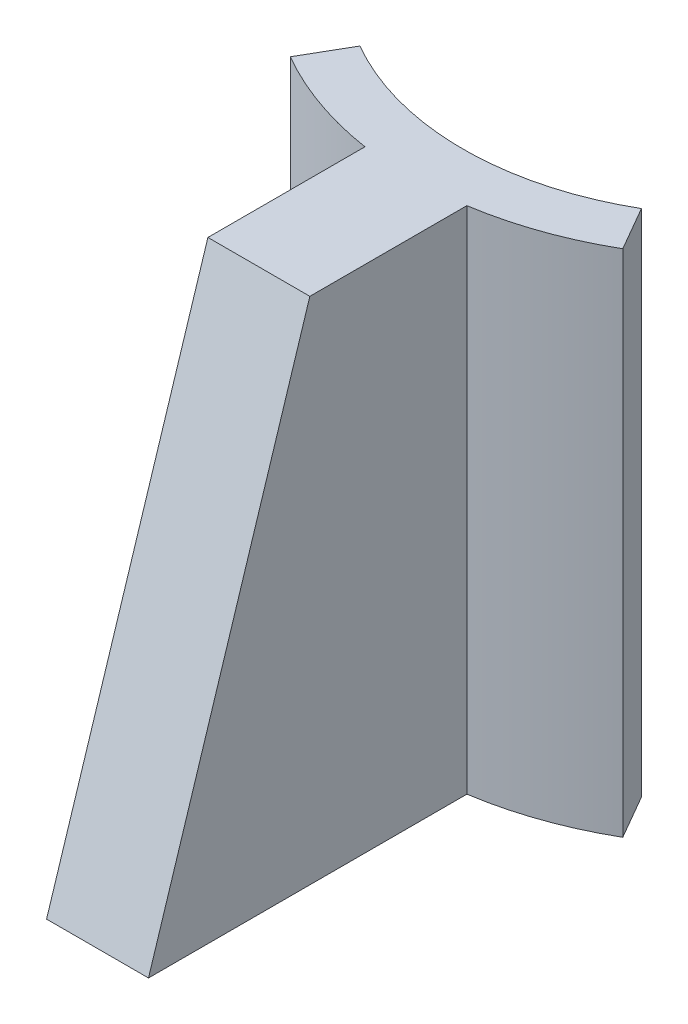
ISO-10303-21;
HEADER;
FILE_DESCRIPTION(('STEP AP214'),'2;1');
FILE_NAME('part.step','',(''),(''),'','','');
FILE_SCHEMA(('AUTOMOTIVE_DESIGN { 1 0 10303 214 1 1 1 1 }'));
ENDSEC;
DATA;
#1=APPLICATION_CONTEXT('core data for automotive mechanical design processes');
#2=APPLICATION_PROTOCOL_DEFINITION('international standard','automotive_design',2000,#1);
#3=PRODUCT_CONTEXT('',#1,'mechanical');
#4=PRODUCT('Part','Part','',(#3));
#5=PRODUCT_RELATED_PRODUCT_CATEGORY('part','',(#4));
#6=PRODUCT_DEFINITION_FORMATION('','',#4);
#7=PRODUCT_DEFINITION_CONTEXT('part definition',#1,'design');
#8=PRODUCT_DEFINITION('design','',#6,#7);
#9=PRODUCT_DEFINITION_SHAPE('','',#8);
#10=(LENGTH_UNIT() NAMED_UNIT(*) SI_UNIT(.MILLI.,.METRE.));
#11=(NAMED_UNIT(*) PLANE_ANGLE_UNIT() SI_UNIT($,.RADIAN.));
#12=(NAMED_UNIT(*) SI_UNIT($,.STERADIAN.) SOLID_ANGLE_UNIT());
#13=UNCERTAINTY_MEASURE_WITH_UNIT(LENGTH_MEASURE(1.E-05),#10,'distance_accuracy_value','');
#14=(GEOMETRIC_REPRESENTATION_CONTEXT(3) GLOBAL_UNCERTAINTY_ASSIGNED_CONTEXT((#13)) GLOBAL_UNIT_ASSIGNED_CONTEXT((#10,
#11,#12)) REPRESENTATION_CONTEXT('',''));
#15=CARTESIAN_POINT('',(0.,0.,0.));
#16=DIRECTION('',(0.,0.,1.));
#17=DIRECTION('',(1.,0.,0.));
#18=AXIS2_PLACEMENT_3D('',#15,#16,#17);
#19=CARTESIAN_POINT('',(-0.5,4.,0.));
#20=DIRECTION('',(0.,1.,0.));
#21=DIRECTION('',(-1.,0.,0.));
#22=AXIS2_PLACEMENT_3D('',#19,#20,#21);
#23=PLANE('',#22);
#24=DIRECTION('',(0.,0.,1.));
#25=VECTOR('',#24,1.);
#26=CARTESIAN_POINT('',(-0.5,4.,0.));
#27=LINE('',#26,#25);
#28=CARTESIAN_POINT('',(-0.5,4.,3.22335229225724));
#29=VERTEX_POINT('',#28);
#30=CARTESIAN_POINT('',(-0.5,4.,6.34647459209148));
#31=VERTEX_POINT('',#30);
#32=EDGE_CURVE('E61',#29,#31,#27,.T.);
#33=ORIENTED_EDGE('',*,*,#32,.F.);
#34=CARTESIAN_POINT('',(0.,4.,0.));
#35=DIRECTION('',(0.,1.,0.));
#36=DIRECTION('',(-1.,0.,0.));
#37=AXIS2_PLACEMENT_3D('',#34,#35,#36);
#38=CIRCLE('',#37,3.26190128606002);
#39=CARTESIAN_POINT('',(-1.6309509276015,4.,2.82488921406768));
#40=VERTEX_POINT('',#39);
#41=EDGE_CURVE('E150',#40,#29,#38,.T.);
#42=ORIENTED_EDGE('',*,*,#41,.F.);
#43=DIRECTION('',(-0.500000041754144,0.,0.866025379677671));
#44=VECTOR('',#43,1.);
#45=CARTESIAN_POINT('',(-1.38095090672443,4.,2.39187652422884));
#46=LINE('',#45,#44);
#47=CARTESIAN_POINT('',(-1.38095090672442,4.,2.39187652422883));
#48=VERTEX_POINT('',#47);
#49=EDGE_CURVE('E134',#48,#40,#46,.T.);
#50=ORIENTED_EDGE('',*,*,#49,.F.);
#51=CARTESIAN_POINT('',(0.,4.,0.));
#52=DIRECTION('',(0.,1.,0.));
#53=DIRECTION('',(-1.,0.,0.));
#54=AXIS2_PLACEMENT_3D('',#51,#52,#53);
#55=CIRCLE('',#54,2.76190128606002);
#56=CARTESIAN_POINT('',(1.38095090672443,4.,2.39187652422884));
#57=VERTEX_POINT('',#56);
#58=EDGE_CURVE('E156',#48,#57,#55,.T.);
#59=ORIENTED_EDGE('',*,*,#58,.T.);
#60=DIRECTION('',(0.499999958245856,0.,0.866025427891203));
#61=VECTOR('',#60,1.);
#62=CARTESIAN_POINT('',(1.38095090672443,4.,2.39187652422884));
#63=LINE('',#62,#61);
#64=CARTESIAN_POINT('',(1.63095088584736,4.,2.82488923817444));
#65=VERTEX_POINT('',#64);
#66=EDGE_CURVE('E153',#57,#65,#63,.T.);
#67=ORIENTED_EDGE('',*,*,#66,.T.);
#68=CARTESIAN_POINT('',(0.5,4.,3.22335229225724));
#69=VERTEX_POINT('',#68);
#70=EDGE_CURVE('E128',#69,#65,#38,.T.);
#71=ORIENTED_EDGE('',*,*,#70,.F.);
#72=DIRECTION('',(0.,0.,1.));
#73=VECTOR('',#72,1.);
#74=CARTESIAN_POINT('',(0.5,4.,0.));
#75=LINE('',#74,#73);
#76=CARTESIAN_POINT('',(0.5,4.,6.34647459209148));
#77=VERTEX_POINT('',#76);
#78=EDGE_CURVE('E179',#69,#77,#75,.T.);
#79=ORIENTED_EDGE('',*,*,#78,.T.);
#80=DIRECTION('',(1.,0.,0.));
#81=VECTOR('',#80,1.);
#82=CARTESIAN_POINT('',(-0.5,4.,6.34647459209148));
#83=LINE('',#82,#81);
#84=EDGE_CURVE('E54',#31,#77,#83,.T.);
#85=ORIENTED_EDGE('',*,*,#84,.F.);
#86=EDGE_LOOP('',(#33,#42,#50,#59,#67,#71,#79,#85));
#87=FACE_BOUND('',#86,.T.);
#88=ADVANCED_FACE('F45',(#87),#23,.F.);
#89=CARTESIAN_POINT('',(-0.5,2.19020181181385,6.91933636144676));
#90=DIRECTION('',(0.,-0.301776321980328,-0.953378755527951));
#91=DIRECTION('',(0.,0.953378755527951,-0.301776321980328));
#92=AXIS2_PLACEMENT_3D('',#89,#90,#91);
#93=PLANE('',#92);
#94=ORIENTED_EDGE('',*,*,#84,.T.);
#95=DIRECTION('',(0.,0.953378755527951,-0.301776321980328));
#96=VECTOR('',#95,1.);
#97=CARTESIAN_POINT('',(0.5,2.19020181181385,6.91933636144676));
#98=LINE('',#97,#96);
#99=CARTESIAN_POINT('',(0.5,8.99999999999999,4.76380705187965));
#100=VERTEX_POINT('',#99);
#101=EDGE_CURVE('E175',#77,#100,#98,.T.);
#102=ORIENTED_EDGE('',*,*,#101,.T.);
#103=DIRECTION('',(1.,0.,0.));
#104=VECTOR('',#103,1.);
#105=CARTESIAN_POINT('',(-0.5,8.99999999999999,4.76380705187965));
#106=LINE('',#105,#104);
#107=CARTESIAN_POINT('',(-0.5,8.99999999999999,4.76380705187965));
#108=VERTEX_POINT('',#107);
#109=EDGE_CURVE('E189',#108,#100,#106,.T.);
#110=ORIENTED_EDGE('',*,*,#109,.F.);
#111=DIRECTION('',(0.,0.953378755527951,-0.301776321980328));
#112=VECTOR('',#111,1.);
#113=CARTESIAN_POINT('',(-0.5,2.19020181181385,6.91933636144676));
#114=LINE('',#113,#112);
#115=EDGE_CURVE('E66',#31,#108,#114,.T.);
#116=ORIENTED_EDGE('',*,*,#115,.F.);
#117=EDGE_LOOP('',(#94,#102,#110,#116));
#118=FACE_BOUND('',#117,.T.);
#119=ADVANCED_FACE('F199',(#118),#93,.F.);
#120=CARTESIAN_POINT('',(-0.5,8.99999999999999,0.));
#121=DIRECTION('',(0.,-1.,0.));
#122=DIRECTION('',(1.,0.,0.));
#123=AXIS2_PLACEMENT_3D('',#120,#121,#122);
#124=PLANE('',#123);
#125=DIRECTION('',(0.,0.,-1.));
#126=VECTOR('',#125,1.);
#127=CARTESIAN_POINT('',(0.5,8.99999999999999,0.));
#128=LINE('',#127,#126);
#129=CARTESIAN_POINT('',(0.5,9.,3.22335229225724));
#130=VERTEX_POINT('',#129);
#131=EDGE_CURVE('E118',#100,#130,#128,.T.);
#132=ORIENTED_EDGE('',*,*,#131,.T.);
#133=CARTESIAN_POINT('',(0.,9.,0.));
#134=DIRECTION('',(0.,1.,0.));
#135=DIRECTION('',(-1.,0.,0.));
#136=AXIS2_PLACEMENT_3D('',#133,#134,#135);
#137=CIRCLE('',#136,3.26190128606002);
#138=CARTESIAN_POINT('',(1.63095088584736,9.,2.82488923817444));
#139=VERTEX_POINT('',#138);
#140=EDGE_CURVE('E111',#130,#139,#137,.T.);
#141=ORIENTED_EDGE('',*,*,#140,.T.);
#142=DIRECTION('',(0.499999958245856,0.,0.866025427891203));
#143=VECTOR('',#142,1.);
#144=CARTESIAN_POINT('',(1.38095090672443,9.,2.39187652422884));
#145=LINE('',#144,#143);
#146=CARTESIAN_POINT('',(1.38095090672443,9.,2.39187652422884));
#147=VERTEX_POINT('',#146);
#148=EDGE_CURVE('E115',#147,#139,#145,.T.);
#149=ORIENTED_EDGE('',*,*,#148,.F.);
#150=CARTESIAN_POINT('',(0.,9.,0.));
#151=DIRECTION('',(0.,1.,0.));
#152=DIRECTION('',(-1.,0.,0.));
#153=AXIS2_PLACEMENT_3D('',#150,#151,#152);
#154=CIRCLE('',#153,2.76190128606002);
#155=CARTESIAN_POINT('',(-1.38095090672442,9.,2.39187652422883));
#156=VERTEX_POINT('',#155);
#157=EDGE_CURVE('E139',#156,#147,#154,.T.);
#158=ORIENTED_EDGE('',*,*,#157,.F.);
#159=DIRECTION('',(-0.500000041754144,0.,0.866025379677671));
#160=VECTOR('',#159,1.);
#161=CARTESIAN_POINT('',(-1.38095090672443,9.,2.39187652422884));
#162=LINE('',#161,#160);
#163=CARTESIAN_POINT('',(-1.6309509276015,9.,2.82488921406768));
#164=VERTEX_POINT('',#163);
#165=EDGE_CURVE('E143',#156,#164,#162,.T.);
#166=ORIENTED_EDGE('',*,*,#165,.T.);
#167=CARTESIAN_POINT('',(-0.5,9.,3.22335229225724));
#168=VERTEX_POINT('',#167);
#169=EDGE_CURVE('E122',#164,#168,#137,.T.);
#170=ORIENTED_EDGE('',*,*,#169,.T.);
#171=DIRECTION('',(0.,0.,-1.));
#172=VECTOR('',#171,1.);
#173=CARTESIAN_POINT('',(-0.5,8.99999999999999,0.));
#174=LINE('',#173,#172);
#175=EDGE_CURVE('E182',#108,#168,#174,.T.);
#176=ORIENTED_EDGE('',*,*,#175,.F.);
#177=ORIENTED_EDGE('',*,*,#109,.T.);
#178=EDGE_LOOP('',(#132,#141,#149,#158,#166,#170,#176,#177));
#179=FACE_BOUND('',#178,.T.);
#180=ADVANCED_FACE('F47',(#179),#124,.F.);
#181=CARTESIAN_POINT('',(-0.5,0.,0.));
#182=DIRECTION('',(1.,0.,0.));
#183=DIRECTION('',(0.,1.,0.));
#184=AXIS2_PLACEMENT_3D('',#181,#182,#183);
#185=PLANE('',#184);
#186=ORIENTED_EDGE('',*,*,#175,.T.);
#187=DIRECTION('',(0.,1.,0.));
#188=VECTOR('',#187,1.);
#189=CARTESIAN_POINT('',(-0.5,4.,3.22335229225724));
#190=LINE('',#189,#188);
#191=EDGE_CURVE('E165',#168,#29,#190,.F.);
#192=ORIENTED_EDGE('',*,*,#191,.T.);
#193=ORIENTED_EDGE('',*,*,#32,.T.);
#194=ORIENTED_EDGE('',*,*,#115,.T.);
#195=EDGE_LOOP('',(#186,#192,#193,#194));
#196=FACE_BOUND('',#195,.T.);
#197=ADVANCED_FACE('F213',(#196),#185,.F.);
#198=CARTESIAN_POINT('',(0.5,0.,0.));
#199=DIRECTION('',(1.,0.,0.));
#200=DIRECTION('',(0.,1.,0.));
#201=AXIS2_PLACEMENT_3D('',#198,#199,#200);
#202=PLANE('',#201);
#203=DIRECTION('',(0.,1.,0.));
#204=VECTOR('',#203,1.);
#205=CARTESIAN_POINT('',(0.5,4.,3.22335229225724));
#206=LINE('',#205,#204);
#207=EDGE_CURVE('E11',#130,#69,#206,.F.);
#208=ORIENTED_EDGE('',*,*,#207,.F.);
#209=ORIENTED_EDGE('',*,*,#131,.F.);
#210=ORIENTED_EDGE('',*,*,#101,.F.);
#211=ORIENTED_EDGE('',*,*,#78,.F.);
#212=EDGE_LOOP('',(#208,#209,#210,#211));
#213=FACE_BOUND('',#212,.T.);
#214=ADVANCED_FACE('F197',(#213),#202,.T.);
#215=CARTESIAN_POINT('',(0.,4.,0.));
#216=DIRECTION('',(0.,1.,0.));
#217=DIRECTION('',(-1.,0.,0.));
#218=AXIS2_PLACEMENT_3D('',#215,#216,#217);
#219=CYLINDRICAL_SURFACE('',#218,3.26190128606002);
#220=ORIENTED_EDGE('',*,*,#191,.F.);
#221=ORIENTED_EDGE('',*,*,#169,.F.);
#222=DIRECTION('',(0.,1.,0.));
#223=VECTOR('',#222,1.);
#224=CARTESIAN_POINT('',(-1.6309509276015,4.,2.82488921406768));
#225=LINE('',#224,#223);
#226=EDGE_CURVE('E162',#40,#164,#225,.T.);
#227=ORIENTED_EDGE('',*,*,#226,.F.);
#228=ORIENTED_EDGE('',*,*,#41,.T.);
#229=EDGE_LOOP('',(#220,#221,#227,#228));
#230=FACE_BOUND('',#229,.T.);
#231=ADVANCED_FACE('F212',(#230),#219,.T.);
#232=ORIENTED_EDGE('',*,*,#140,.F.);
#233=ORIENTED_EDGE('',*,*,#207,.T.);
#234=ORIENTED_EDGE('',*,*,#70,.T.);
#235=DIRECTION('',(0.,1.,0.));
#236=VECTOR('',#235,1.);
#237=CARTESIAN_POINT('',(1.63095088584736,4.,2.82488923817444));
#238=LINE('',#237,#236);
#239=EDGE_CURVE('E125',#65,#139,#238,.T.);
#240=ORIENTED_EDGE('',*,*,#239,.T.);
#241=EDGE_LOOP('',(#232,#233,#234,#240));
#242=FACE_BOUND('',#241,.T.);
#243=ADVANCED_FACE('F126',(#242),#219,.T.);
#244=CARTESIAN_POINT('',(-1.38095090672443,4.,2.39187652422884));
#245=DIRECTION('',(-0.866025379677671,0.,-0.500000041754144));
#246=DIRECTION('',(-0.500000041754144,0.,0.866025379677671));
#247=AXIS2_PLACEMENT_3D('',#244,#245,#246);
#248=PLANE('',#247);
#249=ORIENTED_EDGE('',*,*,#226,.T.);
#250=ORIENTED_EDGE('',*,*,#165,.F.);
#251=DIRECTION('',(0.,1.,0.));
#252=VECTOR('',#251,1.);
#253=CARTESIAN_POINT('',(-1.38095090672442,4.,2.39187652422883));
#254=LINE('',#253,#252);
#255=EDGE_CURVE('E166',#48,#156,#254,.T.);
#256=ORIENTED_EDGE('',*,*,#255,.F.);
#257=ORIENTED_EDGE('',*,*,#49,.T.);
#258=EDGE_LOOP('',(#249,#250,#256,#257));
#259=FACE_BOUND('',#258,.T.);
#260=ADVANCED_FACE('F208',(#259),#248,.T.);
#261=CARTESIAN_POINT('',(0.,4.,0.));
#262=DIRECTION('',(0.,1.,0.));
#263=DIRECTION('',(-1.,0.,0.));
#264=AXIS2_PLACEMENT_3D('',#261,#262,#263);
#265=CYLINDRICAL_SURFACE('',#264,2.76190128606002);
#266=ORIENTED_EDGE('',*,*,#255,.T.);
#267=ORIENTED_EDGE('',*,*,#157,.T.);
#268=DIRECTION('',(0.,1.,0.));
#269=VECTOR('',#268,1.);
#270=CARTESIAN_POINT('',(1.38095090672443,4.,2.39187652422884));
#271=LINE('',#270,#269);
#272=EDGE_CURVE('E133',#57,#147,#271,.T.);
#273=ORIENTED_EDGE('',*,*,#272,.F.);
#274=ORIENTED_EDGE('',*,*,#58,.F.);
#275=EDGE_LOOP('',(#266,#267,#273,#274));
#276=FACE_BOUND('',#275,.T.);
#277=ADVANCED_FACE('F205',(#276),#265,.F.);
#278=CARTESIAN_POINT('',(1.38095090672443,4.,2.39187652422884));
#279=DIRECTION('',(-0.866025427891204,0.,0.499999958245856));
#280=DIRECTION('',(0.499999958245856,0.,0.866025427891204));
#281=AXIS2_PLACEMENT_3D('',#278,#279,#280);
#282=PLANE('',#281);
#283=ORIENTED_EDGE('',*,*,#272,.T.);
#284=ORIENTED_EDGE('',*,*,#148,.T.);
#285=ORIENTED_EDGE('',*,*,#239,.F.);
#286=ORIENTED_EDGE('',*,*,#66,.F.);
#287=EDGE_LOOP('',(#283,#284,#285,#286));
#288=FACE_BOUND('',#287,.T.);
#289=ADVANCED_FACE('F136',(#288),#282,.F.);
#290=CLOSED_SHELL('',(#88,#119,#180,#197,#214,#231,#243,#260,#277,#289));
#291=MANIFOLD_SOLID_BREP('B2',#290);
#292=ADVANCED_BREP_SHAPE_REPRESENTATION('',(#18,#291),#14);
#293=SHAPE_DEFINITION_REPRESENTATION(#9,#292);
ENDSEC;
END-ISO-10303-21;
